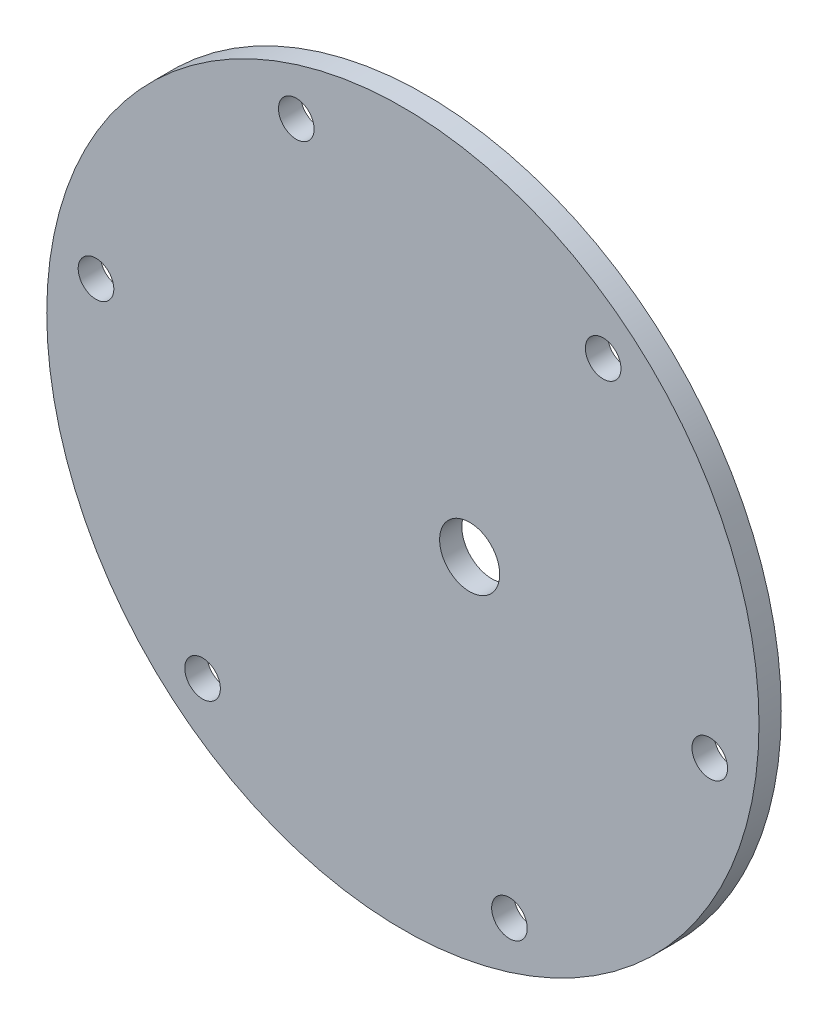
ISO-10303-21;
HEADER;
FILE_DESCRIPTION(('STEP AP214'),'2;1');
FILE_NAME('part.step','',(''),(''),'','','');
FILE_SCHEMA(('AUTOMOTIVE_DESIGN { 1 0 10303 214 1 1 1 1 }'));
ENDSEC;
DATA;
#1=APPLICATION_CONTEXT('core data for automotive mechanical design processes');
#2=APPLICATION_PROTOCOL_DEFINITION('international standard','automotive_design',2000,#1);
#3=PRODUCT_CONTEXT('',#1,'mechanical');
#4=PRODUCT('Part','Part','',(#3));
#5=PRODUCT_RELATED_PRODUCT_CATEGORY('part','',(#4));
#6=PRODUCT_DEFINITION_FORMATION('','',#4);
#7=PRODUCT_DEFINITION_CONTEXT('part definition',#1,'design');
#8=PRODUCT_DEFINITION('design','',#6,#7);
#9=PRODUCT_DEFINITION_SHAPE('','',#8);
#10=(LENGTH_UNIT() NAMED_UNIT(*) SI_UNIT(.MILLI.,.METRE.));
#11=(NAMED_UNIT(*) PLANE_ANGLE_UNIT() SI_UNIT($,.RADIAN.));
#12=(NAMED_UNIT(*) SI_UNIT($,.STERADIAN.) SOLID_ANGLE_UNIT());
#13=UNCERTAINTY_MEASURE_WITH_UNIT(LENGTH_MEASURE(1.E-05),#10,'distance_accuracy_value','');
#14=(GEOMETRIC_REPRESENTATION_CONTEXT(3) GLOBAL_UNCERTAINTY_ASSIGNED_CONTEXT((#13)) GLOBAL_UNIT_ASSIGNED_CONTEXT((#10,
#11,#12)) REPRESENTATION_CONTEXT('',''));
#15=CARTESIAN_POINT('',(0.,0.,0.));
#16=DIRECTION('',(0.,0.,1.));
#17=DIRECTION('',(1.,0.,0.));
#18=AXIS2_PLACEMENT_3D('',#15,#16,#17);
#19=CARTESIAN_POINT('',(0.,0.,5.));
#20=DIRECTION('',(0.,0.,-1.));
#21=DIRECTION('',(-1.,0.,0.));
#22=AXIS2_PLACEMENT_3D('',#19,#20,#21);
#23=CYLINDRICAL_SURFACE('',#22,80.);
#24=CARTESIAN_POINT('',(0.,0.,5.));
#25=DIRECTION('',(0.,0.,1.));
#26=DIRECTION('',(1.,0.,0.));
#27=AXIS2_PLACEMENT_3D('',#24,#25,#26);
#28=CIRCLE('',#27,80.);
#29=CARTESIAN_POINT('',(80.,0.,5.));
#30=VERTEX_POINT('',#29);
#31=EDGE_CURVE('E10',#30,#30,#28,.T.);
#32=ORIENTED_EDGE('',*,*,#31,.F.);
#33=EDGE_LOOP('',(#32));
#34=FACE_BOUND('',#33,.T.);
#35=CARTESIAN_POINT('',(0.,0.,0.));
#36=DIRECTION('',(0.,0.,1.));
#37=DIRECTION('',(1.,0.,0.));
#38=AXIS2_PLACEMENT_3D('',#35,#36,#37);
#39=CIRCLE('',#38,80.);
#40=CARTESIAN_POINT('',(80.,0.,0.));
#41=VERTEX_POINT('',#40);
#42=EDGE_CURVE('E44',#41,#41,#39,.T.);
#43=ORIENTED_EDGE('',*,*,#42,.T.);
#44=EDGE_LOOP('',(#43));
#45=FACE_BOUND('',#44,.T.);
#46=ADVANCED_FACE('F37',(#34,#45),#23,.T.);
#47=CARTESIAN_POINT('',(0.,0.,5.));
#48=DIRECTION('',(0.,0.,1.));
#49=DIRECTION('',(1.,0.,0.));
#50=AXIS2_PLACEMENT_3D('',#47,#48,#49);
#51=PLANE('',#50);
#52=CARTESIAN_POINT('',(-23.9414100327969,65.7784834550136,5.));
#53=DIRECTION('',(0.,0.,-1.));
#54=DIRECTION('',(-1.,0.,0.));
#55=AXIS2_PLACEMENT_3D('',#52,#53,#54);
#56=CIRCLE('',#55,4.);
#57=CARTESIAN_POINT('',(-27.9414100327969,65.7784834550136,5.));
#58=VERTEX_POINT('',#57);
#59=EDGE_CURVE('E61',#58,#58,#56,.T.);
#60=ORIENTED_EDGE('',*,*,#59,.T.);
#61=EDGE_LOOP('',(#60));
#62=FACE_BOUND('',#61,.T.);
#63=CARTESIAN_POINT('',(-68.9365427108546,12.1553724366851,5.));
#64=DIRECTION('',(0.,0.,-1.));
#65=DIRECTION('',(-1.,0.,0.));
#66=AXIS2_PLACEMENT_3D('',#63,#64,#65);
#67=CIRCLE('',#66,4.00000000000001);
#68=CARTESIAN_POINT('',(-72.9365427108546,12.1553724366851,5.));
#69=VERTEX_POINT('',#68);
#70=EDGE_CURVE('E131',#69,#69,#67,.T.);
#71=ORIENTED_EDGE('',*,*,#70,.T.);
#72=EDGE_LOOP('',(#71));
#73=FACE_BOUND('',#72,.T.);
#74=CARTESIAN_POINT('',(-44.9951326780577,-53.6231110183285,5.));
#75=DIRECTION('',(0.,0.,-1.));
#76=DIRECTION('',(-1.,0.,0.));
#77=AXIS2_PLACEMENT_3D('',#74,#75,#76);
#78=CIRCLE('',#77,4.00000000000001);
#79=CARTESIAN_POINT('',(-48.9951326780577,-53.6231110183285,5.));
#80=VERTEX_POINT('',#79);
#81=EDGE_CURVE('E134',#80,#80,#78,.T.);
#82=ORIENTED_EDGE('',*,*,#81,.T.);
#83=EDGE_LOOP('',(#82));
#84=FACE_BOUND('',#83,.T.);
#85=CARTESIAN_POINT('',(23.9414100327969,-65.7784834550136,5.));
#86=DIRECTION('',(0.,0.,-1.));
#87=DIRECTION('',(-1.,0.,0.));
#88=AXIS2_PLACEMENT_3D('',#85,#86,#87);
#89=CIRCLE('',#88,4.);
#90=CARTESIAN_POINT('',(19.9414100327969,-65.7784834550136,5.));
#91=VERTEX_POINT('',#90);
#92=EDGE_CURVE('E139',#91,#91,#89,.T.);
#93=ORIENTED_EDGE('',*,*,#92,.T.);
#94=EDGE_LOOP('',(#93));
#95=FACE_BOUND('',#94,.T.);
#96=CARTESIAN_POINT('',(68.9365427108546,-12.1553724366851,5.));
#97=DIRECTION('',(0.,0.,-1.));
#98=DIRECTION('',(-1.,0.,0.));
#99=AXIS2_PLACEMENT_3D('',#96,#97,#98);
#100=CIRCLE('',#99,4.00000000000001);
#101=CARTESIAN_POINT('',(64.9365427108546,-12.1553724366851,5.));
#102=VERTEX_POINT('',#101);
#103=EDGE_CURVE('E142',#102,#102,#100,.T.);
#104=ORIENTED_EDGE('',*,*,#103,.T.);
#105=EDGE_LOOP('',(#104));
#106=FACE_BOUND('',#105,.T.);
#107=CARTESIAN_POINT('',(44.9951326780577,53.6231110183285,5.));
#108=DIRECTION('',(0.,0.,-1.));
#109=DIRECTION('',(-1.,0.,0.));
#110=AXIS2_PLACEMENT_3D('',#107,#108,#109);
#111=CIRCLE('',#110,4.00000000000001);
#112=CARTESIAN_POINT('',(40.9951326780577,53.6231110183285,5.));
#113=VERTEX_POINT('',#112);
#114=EDGE_CURVE('E144',#113,#113,#111,.T.);
#115=ORIENTED_EDGE('',*,*,#114,.T.);
#116=EDGE_LOOP('',(#115));
#117=FACE_BOUND('',#116,.T.);
#118=CARTESIAN_POINT('',(15.,0.,5.));
#119=DIRECTION('',(0.,0.,-1.));
#120=DIRECTION('',(-1.,0.,0.));
#121=AXIS2_PLACEMENT_3D('',#118,#119,#120);
#122=CIRCLE('',#121,6.75);
#123=CARTESIAN_POINT('',(8.25,0.,5.));
#124=VERTEX_POINT('',#123);
#125=EDGE_CURVE('E52',#124,#124,#122,.T.);
#126=ORIENTED_EDGE('',*,*,#125,.T.);
#127=EDGE_LOOP('',(#126));
#128=FACE_BOUND('',#127,.T.);
#129=ORIENTED_EDGE('',*,*,#31,.T.);
#130=EDGE_LOOP('',(#129));
#131=FACE_BOUND('',#130,.T.);
#132=ADVANCED_FACE('F79',(#62,#73,#84,#95,#106,#117,#128,#131),#51,.T.);
#133=CARTESIAN_POINT('',(0.,0.,0.));
#134=DIRECTION('',(0.,0.,1.));
#135=DIRECTION('',(1.,0.,0.));
#136=AXIS2_PLACEMENT_3D('',#133,#134,#135);
#137=PLANE('',#136);
#138=CARTESIAN_POINT('',(-23.9414100327969,65.7784834550136,0.));
#139=DIRECTION('',(0.,0.,1.));
#140=DIRECTION('',(1.,0.,0.));
#141=AXIS2_PLACEMENT_3D('',#138,#139,#140);
#142=CIRCLE('',#141,4.);
#143=CARTESIAN_POINT('',(-19.9414100327969,65.7784834550136,0.));
#144=VERTEX_POINT('',#143);
#145=EDGE_CURVE('E40',#144,#144,#142,.T.);
#146=ORIENTED_EDGE('',*,*,#145,.T.);
#147=EDGE_LOOP('',(#146));
#148=FACE_BOUND('',#147,.T.);
#149=CARTESIAN_POINT('',(-68.9365427108546,12.1553724366851,0.));
#150=DIRECTION('',(0.,0.,1.));
#151=DIRECTION('',(1.,0.,0.));
#152=AXIS2_PLACEMENT_3D('',#149,#150,#151);
#153=CIRCLE('',#152,4.00000000000001);
#154=CARTESIAN_POINT('',(-64.9365427108546,12.1553724366851,0.));
#155=VERTEX_POINT('',#154);
#156=EDGE_CURVE('E69',#155,#155,#153,.T.);
#157=ORIENTED_EDGE('',*,*,#156,.T.);
#158=EDGE_LOOP('',(#157));
#159=FACE_BOUND('',#158,.T.);
#160=CARTESIAN_POINT('',(-44.9951326780577,-53.6231110183285,0.));
#161=DIRECTION('',(0.,0.,1.));
#162=DIRECTION('',(1.,0.,0.));
#163=AXIS2_PLACEMENT_3D('',#160,#161,#162);
#164=CIRCLE('',#163,4.00000000000001);
#165=CARTESIAN_POINT('',(-40.9951326780577,-53.6231110183285,0.));
#166=VERTEX_POINT('',#165);
#167=EDGE_CURVE('E67',#166,#166,#164,.T.);
#168=ORIENTED_EDGE('',*,*,#167,.T.);
#169=EDGE_LOOP('',(#168));
#170=FACE_BOUND('',#169,.T.);
#171=CARTESIAN_POINT('',(23.9414100327969,-65.7784834550136,0.));
#172=DIRECTION('',(0.,0.,1.));
#173=DIRECTION('',(1.,0.,0.));
#174=AXIS2_PLACEMENT_3D('',#171,#172,#173);
#175=CIRCLE('',#174,4.);
#176=CARTESIAN_POINT('',(27.9414100327969,-65.7784834550136,0.));
#177=VERTEX_POINT('',#176);
#178=EDGE_CURVE('E64',#177,#177,#175,.T.);
#179=ORIENTED_EDGE('',*,*,#178,.T.);
#180=EDGE_LOOP('',(#179));
#181=FACE_BOUND('',#180,.T.);
#182=CARTESIAN_POINT('',(68.9365427108546,-12.1553724366851,0.));
#183=DIRECTION('',(0.,0.,1.));
#184=DIRECTION('',(1.,0.,0.));
#185=AXIS2_PLACEMENT_3D('',#182,#183,#184);
#186=CIRCLE('',#185,4.00000000000001);
#187=CARTESIAN_POINT('',(72.9365427108546,-12.1553724366851,0.));
#188=VERTEX_POINT('',#187);
#189=EDGE_CURVE('E60',#188,#188,#186,.T.);
#190=ORIENTED_EDGE('',*,*,#189,.T.);
#191=EDGE_LOOP('',(#190));
#192=FACE_BOUND('',#191,.T.);
#193=CARTESIAN_POINT('',(44.9951326780577,53.6231110183285,0.));
#194=DIRECTION('',(0.,0.,1.));
#195=DIRECTION('',(1.,0.,0.));
#196=AXIS2_PLACEMENT_3D('',#193,#194,#195);
#197=CIRCLE('',#196,4.00000000000001);
#198=CARTESIAN_POINT('',(48.9951326780577,53.6231110183285,0.));
#199=VERTEX_POINT('',#198);
#200=EDGE_CURVE('E57',#199,#199,#197,.T.);
#201=ORIENTED_EDGE('',*,*,#200,.T.);
#202=EDGE_LOOP('',(#201));
#203=FACE_BOUND('',#202,.T.);
#204=CARTESIAN_POINT('',(15.,0.,0.));
#205=DIRECTION('',(0.,0.,1.));
#206=DIRECTION('',(1.,0.,0.));
#207=AXIS2_PLACEMENT_3D('',#204,#205,#206);
#208=CIRCLE('',#207,6.75);
#209=CARTESIAN_POINT('',(21.75,0.,0.));
#210=VERTEX_POINT('',#209);
#211=EDGE_CURVE('E49',#210,#210,#208,.T.);
#212=ORIENTED_EDGE('',*,*,#211,.T.);
#213=EDGE_LOOP('',(#212));
#214=FACE_BOUND('',#213,.T.);
#215=ORIENTED_EDGE('',*,*,#42,.F.);
#216=EDGE_LOOP('',(#215));
#217=FACE_BOUND('',#216,.T.);
#218=ADVANCED_FACE('F85',(#148,#159,#170,#181,#192,#203,#214,#217),#137,.F.);
#219=CARTESIAN_POINT('',(15.,0.,5.));
#220=DIRECTION('',(0.,0.,-1.));
#221=DIRECTION('',(-1.,0.,0.));
#222=AXIS2_PLACEMENT_3D('',#219,#220,#221);
#223=CYLINDRICAL_SURFACE('',#222,6.75);
#224=ORIENTED_EDGE('',*,*,#125,.F.);
#225=EDGE_LOOP('',(#224));
#226=FACE_BOUND('',#225,.T.);
#227=ORIENTED_EDGE('',*,*,#211,.F.);
#228=EDGE_LOOP('',(#227));
#229=FACE_BOUND('',#228,.T.);
#230=ADVANCED_FACE('F81',(#226,#229),#223,.F.);
#231=CARTESIAN_POINT('',(44.9951326780577,53.6231110183285,5.));
#232=DIRECTION('',(0.,0.,-1.));
#233=DIRECTION('',(-1.,0.,0.));
#234=AXIS2_PLACEMENT_3D('',#231,#232,#233);
#235=CYLINDRICAL_SURFACE('',#234,4.00000000000001);
#236=ORIENTED_EDGE('',*,*,#114,.F.);
#237=EDGE_LOOP('',(#236));
#238=FACE_BOUND('',#237,.T.);
#239=ORIENTED_EDGE('',*,*,#200,.F.);
#240=EDGE_LOOP('',(#239));
#241=FACE_BOUND('',#240,.T.);
#242=ADVANCED_FACE('F84',(#238,#241),#235,.F.);
#243=CARTESIAN_POINT('',(68.9365427108546,-12.1553724366851,5.));
#244=DIRECTION('',(0.,0.,-1.));
#245=DIRECTION('',(-1.,0.,0.));
#246=AXIS2_PLACEMENT_3D('',#243,#244,#245);
#247=CYLINDRICAL_SURFACE('',#246,4.00000000000001);
#248=ORIENTED_EDGE('',*,*,#103,.F.);
#249=EDGE_LOOP('',(#248));
#250=FACE_BOUND('',#249,.T.);
#251=ORIENTED_EDGE('',*,*,#189,.F.);
#252=EDGE_LOOP('',(#251));
#253=FACE_BOUND('',#252,.T.);
#254=ADVANCED_FACE('F107',(#250,#253),#247,.F.);
#255=CARTESIAN_POINT('',(23.9414100327969,-65.7784834550136,5.));
#256=DIRECTION('',(0.,0.,-1.));
#257=DIRECTION('',(-1.,0.,0.));
#258=AXIS2_PLACEMENT_3D('',#255,#256,#257);
#259=CYLINDRICAL_SURFACE('',#258,4.);
#260=ORIENTED_EDGE('',*,*,#92,.F.);
#261=EDGE_LOOP('',(#260));
#262=FACE_BOUND('',#261,.T.);
#263=ORIENTED_EDGE('',*,*,#178,.F.);
#264=EDGE_LOOP('',(#263));
#265=FACE_BOUND('',#264,.T.);
#266=ADVANCED_FACE('F111',(#262,#265),#259,.F.);
#267=CARTESIAN_POINT('',(-44.9951326780577,-53.6231110183285,5.));
#268=DIRECTION('',(0.,0.,-1.));
#269=DIRECTION('',(-1.,0.,0.));
#270=AXIS2_PLACEMENT_3D('',#267,#268,#269);
#271=CYLINDRICAL_SURFACE('',#270,4.00000000000001);
#272=ORIENTED_EDGE('',*,*,#81,.F.);
#273=EDGE_LOOP('',(#272));
#274=FACE_BOUND('',#273,.T.);
#275=ORIENTED_EDGE('',*,*,#167,.F.);
#276=EDGE_LOOP('',(#275));
#277=FACE_BOUND('',#276,.T.);
#278=ADVANCED_FACE('F115',(#274,#277),#271,.F.);
#279=CARTESIAN_POINT('',(-68.9365427108546,12.1553724366851,5.));
#280=DIRECTION('',(0.,0.,-1.));
#281=DIRECTION('',(-1.,0.,0.));
#282=AXIS2_PLACEMENT_3D('',#279,#280,#281);
#283=CYLINDRICAL_SURFACE('',#282,4.00000000000001);
#284=ORIENTED_EDGE('',*,*,#70,.F.);
#285=EDGE_LOOP('',(#284));
#286=FACE_BOUND('',#285,.T.);
#287=ORIENTED_EDGE('',*,*,#156,.F.);
#288=EDGE_LOOP('',(#287));
#289=FACE_BOUND('',#288,.T.);
#290=ADVANCED_FACE('F119',(#286,#289),#283,.F.);
#291=CARTESIAN_POINT('',(-23.9414100327969,65.7784834550136,5.));
#292=DIRECTION('',(0.,0.,-1.));
#293=DIRECTION('',(-1.,0.,0.));
#294=AXIS2_PLACEMENT_3D('',#291,#292,#293);
#295=CYLINDRICAL_SURFACE('',#294,4.);
#296=ORIENTED_EDGE('',*,*,#59,.F.);
#297=EDGE_LOOP('',(#296));
#298=FACE_BOUND('',#297,.T.);
#299=ORIENTED_EDGE('',*,*,#145,.F.);
#300=EDGE_LOOP('',(#299));
#301=FACE_BOUND('',#300,.T.);
#302=ADVANCED_FACE('F123',(#298,#301),#295,.F.);
#303=CLOSED_SHELL('',(#46,#132,#218,#230,#242,#254,#266,#278,#290,#302));
#304=MANIFOLD_SOLID_BREP('B2',#303);
#305=ADVANCED_BREP_SHAPE_REPRESENTATION('',(#18,#304),#14);
#306=SHAPE_DEFINITION_REPRESENTATION(#9,#305);
ENDSEC;
END-ISO-10303-21;
